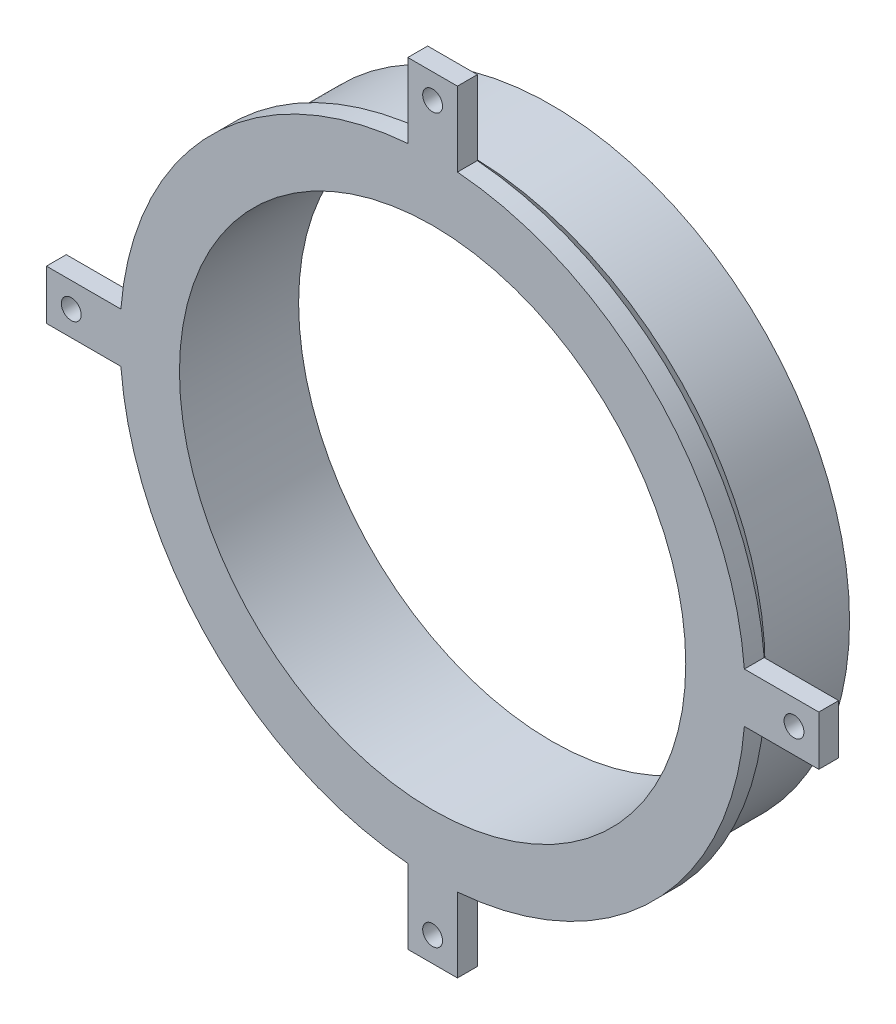
ISO-10303-21;
HEADER;
FILE_DESCRIPTION(('STEP AP214'),'2;1');
FILE_NAME('part.step','',(''),(''),'','','');
FILE_SCHEMA(('AUTOMOTIVE_DESIGN { 1 0 10303 214 1 1 1 1 }'));
ENDSEC;
DATA;
#1=APPLICATION_CONTEXT('core data for automotive mechanical design processes');
#2=APPLICATION_PROTOCOL_DEFINITION('international standard','automotive_design',2000,#1);
#3=PRODUCT_CONTEXT('',#1,'mechanical');
#4=PRODUCT('Part','Part','',(#3));
#5=PRODUCT_RELATED_PRODUCT_CATEGORY('part','',(#4));
#6=PRODUCT_DEFINITION_FORMATION('','',#4);
#7=PRODUCT_DEFINITION_CONTEXT('part definition',#1,'design');
#8=PRODUCT_DEFINITION('design','',#6,#7);
#9=PRODUCT_DEFINITION_SHAPE('','',#8);
#10=(LENGTH_UNIT() NAMED_UNIT(*) SI_UNIT(.MILLI.,.METRE.));
#11=(NAMED_UNIT(*) PLANE_ANGLE_UNIT() SI_UNIT($,.RADIAN.));
#12=(NAMED_UNIT(*) SI_UNIT($,.STERADIAN.) SOLID_ANGLE_UNIT());
#13=UNCERTAINTY_MEASURE_WITH_UNIT(LENGTH_MEASURE(1.E-05),#10,'distance_accuracy_value','');
#14=(GEOMETRIC_REPRESENTATION_CONTEXT(3) GLOBAL_UNCERTAINTY_ASSIGNED_CONTEXT((#13)) GLOBAL_UNIT_ASSIGNED_CONTEXT((#10,
#11,#12)) REPRESENTATION_CONTEXT('',''));
#15=CARTESIAN_POINT('',(0.,0.,0.));
#16=DIRECTION('',(0.,0.,1.));
#17=DIRECTION('',(1.,0.,0.));
#18=AXIS2_PLACEMENT_3D('',#15,#16,#17);
#19=CARTESIAN_POINT('',(0.,0.,0.));
#20=DIRECTION('',(0.,0.,1.));
#21=DIRECTION('',(1.,0.,0.));
#22=AXIS2_PLACEMENT_3D('',#19,#20,#21);
#23=PLANE('',#22);
#24=CARTESIAN_POINT('',(4.12044213492661E-12,-72.8012738724303,0.));
#25=DIRECTION('',(0.,0.,1.));
#26=DIRECTION('',(1.,0.,0.));
#27=AXIS2_PLACEMENT_3D('',#24,#25,#26);
#28=CIRCLE('',#27,2.00000000000443);
#29=CARTESIAN_POINT('',(2.00000000000855,-72.8012738724303,0.));
#30=VERTEX_POINT('',#29);
#31=EDGE_CURVE('E310',#30,#30,#28,.T.);
#32=ORIENTED_EDGE('',*,*,#31,.T.);
#33=EDGE_LOOP('',(#32));
#34=FACE_BOUND('',#33,.T.);
#35=DIRECTION('',(0.,-1.,0.));
#36=VECTOR('',#35,1.);
#37=CARTESIAN_POINT('',(-4.99999999999999,-77.8012738724305,0.));
#38=LINE('',#37,#36);
#39=CARTESIAN_POINT('',(-4.99999999999999,-62.8012738724304,0.));
#40=VERTEX_POINT('',#39);
#41=CARTESIAN_POINT('',(-4.99999999999999,-77.8012738724305,0.));
#42=VERTEX_POINT('',#41);
#43=EDGE_CURVE('E284',#40,#42,#38,.T.);
#44=ORIENTED_EDGE('',*,*,#43,.F.);
#45=CARTESIAN_POINT('',(0.,0.,0.));
#46=DIRECTION('',(0.,0.,1.));
#47=DIRECTION('',(1.,0.,0.));
#48=AXIS2_PLACEMENT_3D('',#45,#46,#47);
#49=CIRCLE('',#48,63.);
#50=CARTESIAN_POINT('',(5.00000000000008,-62.8012738724312,0.));
#51=VERTEX_POINT('',#50);
#52=EDGE_CURVE('E11',#40,#51,#49,.T.);
#53=ORIENTED_EDGE('',*,*,#52,.T.);
#54=DIRECTION('',(0.,1.,0.));
#55=VECTOR('',#54,1.);
#56=CARTESIAN_POINT('',(5.00000000000001,-77.8012738724305,0.));
#57=LINE('',#56,#55);
#58=CARTESIAN_POINT('',(5.00000000000001,-77.8012738724305,0.));
#59=VERTEX_POINT('',#58);
#60=EDGE_CURVE('E278',#59,#51,#57,.T.);
#61=ORIENTED_EDGE('',*,*,#60,.F.);
#62=DIRECTION('',(1.,0.,0.));
#63=VECTOR('',#62,1.);
#64=CARTESIAN_POINT('',(5.00000000000001,-77.8012738724305,0.));
#65=LINE('',#64,#63);
#66=EDGE_CURVE('E281',#42,#59,#65,.T.);
#67=ORIENTED_EDGE('',*,*,#66,.F.);
#68=EDGE_LOOP('',(#44,#53,#61,#67));
#69=FACE_BOUND('',#68,.T.);
#70=ADVANCED_FACE('F33',(#34,#69),#23,.F.);
#71=CARTESIAN_POINT('',(72.8012738724324,2.06022106746331E-12,0.));
#72=DIRECTION('',(0.,0.,1.));
#73=DIRECTION('',(1.,0.,0.));
#74=AXIS2_PLACEMENT_3D('',#71,#72,#73);
#75=CIRCLE('',#74,2.00000000000162);
#76=CARTESIAN_POINT('',(74.801273872434,2.06022106746331E-12,0.));
#77=VERTEX_POINT('',#76);
#78=EDGE_CURVE('E304',#77,#77,#75,.T.);
#79=ORIENTED_EDGE('',*,*,#78,.T.);
#80=EDGE_LOOP('',(#79));
#81=FACE_BOUND('',#80,.T.);
#82=DIRECTION('',(1.,0.,0.));
#83=VECTOR('',#82,1.);
#84=CARTESIAN_POINT('',(77.8012738724319,-5.00000000000012,0.));
#85=LINE('',#84,#83);
#86=CARTESIAN_POINT('',(62.8012738724319,-5.00000000000012,0.));
#87=VERTEX_POINT('',#86);
#88=CARTESIAN_POINT('',(77.8012738724319,-5.00000000000012,0.));
#89=VERTEX_POINT('',#88);
#90=EDGE_CURVE('E272',#87,#89,#85,.T.);
#91=ORIENTED_EDGE('',*,*,#90,.F.);
#92=CARTESIAN_POINT('',(0.,0.,0.));
#93=DIRECTION('',(0.,0.,1.));
#94=DIRECTION('',(1.,0.,0.));
#95=AXIS2_PLACEMENT_3D('',#92,#93,#94);
#96=CIRCLE('',#95,63.);
#97=CARTESIAN_POINT('',(62.8012738724311,4.99999999999982,0.));
#98=VERTEX_POINT('',#97);
#99=EDGE_CURVE('E42',#87,#98,#96,.T.);
#100=ORIENTED_EDGE('',*,*,#99,.T.);
#101=DIRECTION('',(-1.,0.,0.));
#102=VECTOR('',#101,1.);
#103=CARTESIAN_POINT('',(77.8012738724319,4.99999999999988,0.));
#104=LINE('',#103,#102);
#105=CARTESIAN_POINT('',(77.8012738724319,4.99999999999988,0.));
#106=VERTEX_POINT('',#105);
#107=EDGE_CURVE('E173',#106,#98,#104,.T.);
#108=ORIENTED_EDGE('',*,*,#107,.F.);
#109=DIRECTION('',(0.,1.,0.));
#110=VECTOR('',#109,1.);
#111=CARTESIAN_POINT('',(77.8012738724319,4.99999999999988,0.));
#112=LINE('',#111,#110);
#113=EDGE_CURVE('E269',#89,#106,#112,.T.);
#114=ORIENTED_EDGE('',*,*,#113,.F.);
#115=EDGE_LOOP('',(#91,#100,#108,#114));
#116=FACE_BOUND('',#115,.T.);
#117=ADVANCED_FACE('F358',(#81,#116),#23,.F.);
#118=CARTESIAN_POINT('',(0.,72.8012738724303,0.));
#119=DIRECTION('',(0.,0.,1.));
#120=DIRECTION('',(1.,0.,0.));
#121=AXIS2_PLACEMENT_3D('',#118,#119,#120);
#122=CIRCLE('',#121,2.);
#123=CARTESIAN_POINT('',(2.,72.8012738724303,0.));
#124=VERTEX_POINT('',#123);
#125=EDGE_CURVE('E266',#124,#124,#122,.T.);
#126=ORIENTED_EDGE('',*,*,#125,.T.);
#127=EDGE_LOOP('',(#126));
#128=FACE_BOUND('',#127,.T.);
#129=DIRECTION('',(0.,1.,0.));
#130=VECTOR('',#129,1.);
#131=CARTESIAN_POINT('',(5.,77.8012738724303,0.));
#132=LINE('',#131,#130);
#133=CARTESIAN_POINT('',(5.,62.8012738724303,0.));
#134=VERTEX_POINT('',#133);
#135=CARTESIAN_POINT('',(5.,77.8012738724303,0.));
#136=VERTEX_POINT('',#135);
#137=EDGE_CURVE('E154',#134,#136,#132,.T.);
#138=ORIENTED_EDGE('',*,*,#137,.F.);
#139=CARTESIAN_POINT('',(0.,0.,0.));
#140=DIRECTION('',(0.,0.,1.));
#141=DIRECTION('',(1.,0.,0.));
#142=AXIS2_PLACEMENT_3D('',#139,#140,#141);
#143=CIRCLE('',#142,63.);
#144=CARTESIAN_POINT('',(-5.,62.8012738724303,0.));
#145=VERTEX_POINT('',#144);
#146=EDGE_CURVE('E115',#134,#145,#143,.T.);
#147=ORIENTED_EDGE('',*,*,#146,.T.);
#148=DIRECTION('',(0.,-1.,0.));
#149=VECTOR('',#148,1.);
#150=CARTESIAN_POINT('',(-5.,77.8012738724303,0.));
#151=LINE('',#150,#149);
#152=CARTESIAN_POINT('',(-5.,77.8012738724303,0.));
#153=VERTEX_POINT('',#152);
#154=EDGE_CURVE('E223',#153,#145,#151,.T.);
#155=ORIENTED_EDGE('',*,*,#154,.F.);
#156=DIRECTION('',(-1.,0.,0.));
#157=VECTOR('',#156,1.);
#158=CARTESIAN_POINT('',(-5.,77.8012738724303,0.));
#159=LINE('',#158,#157);
#160=EDGE_CURVE('E164',#136,#153,#159,.T.);
#161=ORIENTED_EDGE('',*,*,#160,.F.);
#162=EDGE_LOOP('',(#138,#147,#155,#161));
#163=FACE_BOUND('',#162,.T.);
#164=ADVANCED_FACE('F163',(#128,#163),#23,.F.);
#165=CARTESIAN_POINT('',(0.,0.,0.));
#166=DIRECTION('',(0.,0.,-1.));
#167=DIRECTION('',(-1.,0.,0.));
#168=AXIS2_PLACEMENT_3D('',#165,#166,#167);
#169=CIRCLE('',#168,57.);
#170=CARTESIAN_POINT('',(-57.,0.,0.));
#171=VERTEX_POINT('',#170);
#172=EDGE_CURVE('E328',#171,#171,#169,.T.);
#173=ORIENTED_EDGE('',*,*,#172,.T.);
#174=EDGE_LOOP('',(#173));
#175=FACE_BOUND('',#174,.T.);
#176=CARTESIAN_POINT('',(0.,0.,0.));
#177=DIRECTION('',(0.,0.,1.));
#178=DIRECTION('',(1.,0.,0.));
#179=AXIS2_PLACEMENT_3D('',#176,#177,#178);
#180=CIRCLE('',#179,55.);
#181=CARTESIAN_POINT('',(55.,0.,0.));
#182=VERTEX_POINT('',#181);
#183=EDGE_CURVE('E187',#182,#182,#180,.F.);
#184=ORIENTED_EDGE('',*,*,#183,.F.);
#185=EDGE_LOOP('',(#184));
#186=FACE_BOUND('',#185,.T.);
#187=ADVANCED_FACE('F370',(#175,#186),#23,.F.);
#188=CARTESIAN_POINT('',(0.,0.,4.));
#189=DIRECTION('',(0.,0.,1.));
#190=DIRECTION('',(1.,0.,0.));
#191=AXIS2_PLACEMENT_3D('',#188,#189,#190);
#192=PLANE('',#191);
#193=CARTESIAN_POINT('',(0.,0.,4.));
#194=DIRECTION('',(0.,0.,1.));
#195=DIRECTION('',(1.,0.,0.));
#196=AXIS2_PLACEMENT_3D('',#193,#194,#195);
#197=CIRCLE('',#196,51.);
#198=CARTESIAN_POINT('',(51.,0.,4.));
#199=VERTEX_POINT('',#198);
#200=EDGE_CURVE('E190',#199,#199,#197,.T.);
#201=ORIENTED_EDGE('',*,*,#200,.F.);
#202=EDGE_LOOP('',(#201));
#203=FACE_BOUND('',#202,.T.);
#204=CARTESIAN_POINT('',(-72.8012738724283,-2.06913665216548E-12,4.));
#205=DIRECTION('',(0.,0.,1.));
#206=DIRECTION('',(1.,0.,0.));
#207=AXIS2_PLACEMENT_3D('',#204,#205,#206);
#208=CIRCLE('',#207,2.00000000000331);
#209=CARTESIAN_POINT('',(-70.801273872425,-2.06913665216548E-12,4.));
#210=VERTEX_POINT('',#209);
#211=EDGE_CURVE('E319',#210,#210,#208,.T.);
#212=ORIENTED_EDGE('',*,*,#211,.F.);
#213=EDGE_LOOP('',(#212));
#214=FACE_BOUND('',#213,.T.);
#215=CARTESIAN_POINT('',(4.12044213492661E-12,-72.8012738724303,4.));
#216=DIRECTION('',(0.,0.,1.));
#217=DIRECTION('',(1.,0.,0.));
#218=AXIS2_PLACEMENT_3D('',#215,#216,#217);
#219=CIRCLE('',#218,2.00000000000443);
#220=CARTESIAN_POINT('',(2.00000000000855,-72.8012738724303,4.));
#221=VERTEX_POINT('',#220);
#222=EDGE_CURVE('E313',#221,#221,#219,.T.);
#223=ORIENTED_EDGE('',*,*,#222,.F.);
#224=EDGE_LOOP('',(#223));
#225=FACE_BOUND('',#224,.T.);
#226=CARTESIAN_POINT('',(72.8012738724324,2.06022106746331E-12,4.));
#227=DIRECTION('',(0.,0.,1.));
#228=DIRECTION('',(1.,0.,0.));
#229=AXIS2_PLACEMENT_3D('',#226,#227,#228);
#230=CIRCLE('',#229,2.00000000000162);
#231=CARTESIAN_POINT('',(74.801273872434,2.06022106746331E-12,4.));
#232=VERTEX_POINT('',#231);
#233=EDGE_CURVE('E307',#232,#232,#230,.T.);
#234=ORIENTED_EDGE('',*,*,#233,.F.);
#235=EDGE_LOOP('',(#234));
#236=FACE_BOUND('',#235,.T.);
#237=CARTESIAN_POINT('',(0.,72.8012738724303,4.));
#238=DIRECTION('',(0.,0.,1.));
#239=DIRECTION('',(1.,0.,0.));
#240=AXIS2_PLACEMENT_3D('',#237,#238,#239);
#241=CIRCLE('',#240,2.);
#242=CARTESIAN_POINT('',(2.,72.8012738724303,4.));
#243=VERTEX_POINT('',#242);
#244=EDGE_CURVE('E301',#243,#243,#241,.T.);
#245=ORIENTED_EDGE('',*,*,#244,.F.);
#246=EDGE_LOOP('',(#245));
#247=FACE_BOUND('',#246,.T.);
#248=DIRECTION('',(0.,-1.,0.));
#249=VECTOR('',#248,1.);
#250=CARTESIAN_POINT('',(-5.,77.8012738724303,4.));
#251=LINE('',#250,#249);
#252=CARTESIAN_POINT('',(-5.,77.8012738724303,4.));
#253=VERTEX_POINT('',#252);
#254=CARTESIAN_POINT('',(-5.,62.8012738724303,4.));
#255=VERTEX_POINT('',#254);
#256=EDGE_CURVE('E263',#253,#255,#251,.T.);
#257=ORIENTED_EDGE('',*,*,#256,.T.);
#258=CARTESIAN_POINT('',(0.,0.,4.));
#259=DIRECTION('',(0.,0.,1.));
#260=DIRECTION('',(1.,0.,0.));
#261=AXIS2_PLACEMENT_3D('',#258,#259,#260);
#262=CIRCLE('',#261,63.);
#263=CARTESIAN_POINT('',(-62.8012738724304,4.99999999999844,4.));
#264=VERTEX_POINT('',#263);
#265=EDGE_CURVE('E260',#255,#264,#262,.T.);
#266=ORIENTED_EDGE('',*,*,#265,.T.);
#267=DIRECTION('',(-1.,0.,0.));
#268=VECTOR('',#267,1.);
#269=CARTESIAN_POINT('',(-77.8012738724305,4.99999999999842,4.));
#270=LINE('',#269,#268);
#271=CARTESIAN_POINT('',(-77.8012738724305,4.99999999999842,4.));
#272=VERTEX_POINT('',#271);
#273=EDGE_CURVE('E257',#264,#272,#270,.T.);
#274=ORIENTED_EDGE('',*,*,#273,.T.);
#275=DIRECTION('',(0.,-1.,0.));
#276=VECTOR('',#275,1.);
#277=CARTESIAN_POINT('',(-77.8012738724305,-5.00000000000158,4.));
#278=LINE('',#277,#276);
#279=CARTESIAN_POINT('',(-77.8012738724305,-5.00000000000158,4.));
#280=VERTEX_POINT('',#279);
#281=EDGE_CURVE('E254',#272,#280,#278,.T.);
#282=ORIENTED_EDGE('',*,*,#281,.T.);
#283=DIRECTION('',(1.,0.,0.));
#284=VECTOR('',#283,1.);
#285=CARTESIAN_POINT('',(-77.8012738724305,-5.00000000000158,4.));
#286=LINE('',#285,#284);
#287=CARTESIAN_POINT('',(-62.8012738724304,-5.00000000000156,4.));
#288=VERTEX_POINT('',#287);
#289=EDGE_CURVE('E251',#280,#288,#286,.T.);
#290=ORIENTED_EDGE('',*,*,#289,.T.);
#291=CARTESIAN_POINT('',(0.,0.,4.));
#292=DIRECTION('',(0.,0.,1.));
#293=DIRECTION('',(1.,0.,0.));
#294=AXIS2_PLACEMENT_3D('',#291,#292,#293);
#295=CIRCLE('',#294,63.0000000000002);
#296=CARTESIAN_POINT('',(-4.99999999999999,-62.8012738724304,4.));
#297=VERTEX_POINT('',#296);
#298=EDGE_CURVE('E248',#288,#297,#295,.T.);
#299=ORIENTED_EDGE('',*,*,#298,.T.);
#300=DIRECTION('',(0.,-1.,0.));
#301=VECTOR('',#300,1.);
#302=CARTESIAN_POINT('',(-4.99999999999999,-77.8012738724305,4.));
#303=LINE('',#302,#301);
#304=CARTESIAN_POINT('',(-4.99999999999999,-77.8012738724305,4.));
#305=VERTEX_POINT('',#304);
#306=EDGE_CURVE('E245',#297,#305,#303,.T.);
#307=ORIENTED_EDGE('',*,*,#306,.T.);
#308=DIRECTION('',(1.,0.,0.));
#309=VECTOR('',#308,1.);
#310=CARTESIAN_POINT('',(5.00000000000001,-77.8012738724305,4.));
#311=LINE('',#310,#309);
#312=CARTESIAN_POINT('',(5.00000000000001,-77.8012738724305,4.));
#313=VERTEX_POINT('',#312);
#314=EDGE_CURVE('E242',#305,#313,#311,.T.);
#315=ORIENTED_EDGE('',*,*,#314,.T.);
#316=DIRECTION('',(0.,1.,0.));
#317=VECTOR('',#316,1.);
#318=CARTESIAN_POINT('',(5.00000000000001,-77.8012738724305,4.));
#319=LINE('',#318,#317);
#320=CARTESIAN_POINT('',(5.00000000000008,-62.8012738724312,4.));
#321=VERTEX_POINT('',#320);
#322=EDGE_CURVE('E239',#313,#321,#319,.T.);
#323=ORIENTED_EDGE('',*,*,#322,.T.);
#324=CARTESIAN_POINT('',(0.,0.,4.));
#325=DIRECTION('',(0.,0.,1.));
#326=DIRECTION('',(1.,0.,0.));
#327=AXIS2_PLACEMENT_3D('',#324,#325,#326);
#328=CIRCLE('',#327,63.0000000000009);
#329=CARTESIAN_POINT('',(62.8012738724319,-5.00000000000012,4.));
#330=VERTEX_POINT('',#329);
#331=EDGE_CURVE('E236',#321,#330,#328,.T.);
#332=ORIENTED_EDGE('',*,*,#331,.T.);
#333=DIRECTION('',(1.,0.,0.));
#334=VECTOR('',#333,1.);
#335=CARTESIAN_POINT('',(77.8012738724319,-5.00000000000012,4.));
#336=LINE('',#335,#334);
#337=CARTESIAN_POINT('',(77.8012738724319,-5.00000000000012,4.));
#338=VERTEX_POINT('',#337);
#339=EDGE_CURVE('E233',#330,#338,#336,.T.);
#340=ORIENTED_EDGE('',*,*,#339,.T.);
#341=DIRECTION('',(0.,1.,0.));
#342=VECTOR('',#341,1.);
#343=CARTESIAN_POINT('',(77.8012738724319,4.99999999999988,4.));
#344=LINE('',#343,#342);
#345=CARTESIAN_POINT('',(77.8012738724319,4.99999999999988,4.));
#346=VERTEX_POINT('',#345);
#347=EDGE_CURVE('E230',#338,#346,#344,.T.);
#348=ORIENTED_EDGE('',*,*,#347,.T.);
#349=DIRECTION('',(-1.,0.,0.));
#350=VECTOR('',#349,1.);
#351=CARTESIAN_POINT('',(77.8012738724319,4.99999999999988,4.));
#352=LINE('',#351,#350);
#353=CARTESIAN_POINT('',(62.8012738724311,4.99999999999982,4.));
#354=VERTEX_POINT('',#353);
#355=EDGE_CURVE('E227',#346,#354,#352,.T.);
#356=ORIENTED_EDGE('',*,*,#355,.T.);
#357=CARTESIAN_POINT('',(0.,0.,4.));
#358=DIRECTION('',(0.,0.,1.));
#359=DIRECTION('',(1.,0.,0.));
#360=AXIS2_PLACEMENT_3D('',#357,#358,#359);
#361=CIRCLE('',#360,63.0000000000008);
#362=CARTESIAN_POINT('',(5.,62.8012738724303,4.));
#363=VERTEX_POINT('',#362);
#364=EDGE_CURVE('E225',#354,#363,#361,.T.);
#365=ORIENTED_EDGE('',*,*,#364,.T.);
#366=DIRECTION('',(0.,1.,0.));
#367=VECTOR('',#366,1.);
#368=CARTESIAN_POINT('',(5.,77.8012738724303,4.));
#369=LINE('',#368,#367);
#370=CARTESIAN_POINT('',(5.,77.8012738724303,4.));
#371=VERTEX_POINT('',#370);
#372=EDGE_CURVE('E156',#363,#371,#369,.T.);
#373=ORIENTED_EDGE('',*,*,#372,.T.);
#374=DIRECTION('',(-1.,0.,0.));
#375=VECTOR('',#374,1.);
#376=CARTESIAN_POINT('',(-5.,77.8012738724303,4.));
#377=LINE('',#376,#375);
#378=EDGE_CURVE('E220',#371,#253,#377,.T.);
#379=ORIENTED_EDGE('',*,*,#378,.T.);
#380=EDGE_LOOP('',(#257,#266,#274,#282,#290,#299,#307,#315,#323,#332,#340,#348,#356,#365,#373,#379));
#381=FACE_BOUND('',#380,.T.);
#382=ADVANCED_FACE('F368',(#203,#214,#225,#236,#247,#381),#192,.T.);
#383=CARTESIAN_POINT('',(-72.8012738724283,-2.06913665216548E-12,0.));
#384=DIRECTION('',(0.,0.,1.));
#385=DIRECTION('',(1.,0.,0.));
#386=AXIS2_PLACEMENT_3D('',#383,#384,#385);
#387=CIRCLE('',#386,2.00000000000331);
#388=CARTESIAN_POINT('',(-70.801273872425,-2.06913665216548E-12,0.));
#389=VERTEX_POINT('',#388);
#390=EDGE_CURVE('E316',#389,#389,#387,.T.);
#391=ORIENTED_EDGE('',*,*,#390,.T.);
#392=EDGE_LOOP('',(#391));
#393=FACE_BOUND('',#392,.T.);
#394=DIRECTION('',(-1.,0.,0.));
#395=VECTOR('',#394,1.);
#396=CARTESIAN_POINT('',(-77.8012738724305,4.99999999999842,0.));
#397=LINE('',#396,#395);
#398=CARTESIAN_POINT('',(-62.8012738724304,4.99999999999844,0.));
#399=VERTEX_POINT('',#398);
#400=CARTESIAN_POINT('',(-77.8012738724305,4.99999999999842,0.));
#401=VERTEX_POINT('',#400);
#402=EDGE_CURVE('E296',#399,#401,#397,.T.);
#403=ORIENTED_EDGE('',*,*,#402,.F.);
#404=CARTESIAN_POINT('',(0.,0.,0.));
#405=DIRECTION('',(0.,0.,1.));
#406=DIRECTION('',(1.,0.,0.));
#407=AXIS2_PLACEMENT_3D('',#404,#405,#406);
#408=CIRCLE('',#407,63.);
#409=CARTESIAN_POINT('',(-62.8012738724304,-5.00000000000156,0.));
#410=VERTEX_POINT('',#409);
#411=EDGE_CURVE('E180',#399,#410,#408,.T.);
#412=ORIENTED_EDGE('',*,*,#411,.T.);
#413=DIRECTION('',(1.,0.,0.));
#414=VECTOR('',#413,1.);
#415=CARTESIAN_POINT('',(-77.8012738724305,-5.00000000000158,0.));
#416=LINE('',#415,#414);
#417=CARTESIAN_POINT('',(-77.8012738724305,-5.00000000000158,0.));
#418=VERTEX_POINT('',#417);
#419=EDGE_CURVE('E290',#418,#410,#416,.T.);
#420=ORIENTED_EDGE('',*,*,#419,.F.);
#421=DIRECTION('',(0.,-1.,0.));
#422=VECTOR('',#421,1.);
#423=CARTESIAN_POINT('',(-77.8012738724305,-5.00000000000158,0.));
#424=LINE('',#423,#422);
#425=EDGE_CURVE('E293',#401,#418,#424,.T.);
#426=ORIENTED_EDGE('',*,*,#425,.F.);
#427=EDGE_LOOP('',(#403,#412,#420,#426));
#428=FACE_BOUND('',#427,.T.);
#429=ADVANCED_FACE('F360',(#393,#428),#23,.F.);
#430=CARTESIAN_POINT('',(0.,0.,4.));
#431=DIRECTION('',(0.,0.,-1.));
#432=DIRECTION('',(-1.,0.,0.));
#433=AXIS2_PLACEMENT_3D('',#430,#431,#432);
#434=CYLINDRICAL_SURFACE('',#433,51.);
#435=ORIENTED_EDGE('',*,*,#200,.T.);
#436=EDGE_LOOP('',(#435));
#437=FACE_BOUND('',#436,.T.);
#438=CARTESIAN_POINT('',(0.,0.,-20.));
#439=DIRECTION('',(0.,0.,-1.));
#440=DIRECTION('',(-1.,0.,0.));
#441=AXIS2_PLACEMENT_3D('',#438,#439,#440);
#442=CIRCLE('',#441,51.);
#443=CARTESIAN_POINT('',(-51.,0.,-20.));
#444=VERTEX_POINT('',#443);
#445=EDGE_CURVE('E336',#444,#444,#442,.T.);
#446=ORIENTED_EDGE('',*,*,#445,.T.);
#447=EDGE_LOOP('',(#446));
#448=FACE_BOUND('',#447,.T.);
#449=ADVANCED_FACE('F340',(#437,#448),#434,.F.);
#450=CARTESIAN_POINT('',(-5.,77.8012738724303,0.));
#451=DIRECTION('',(-1.,0.,0.));
#452=DIRECTION('',(0.,-1.,0.));
#453=AXIS2_PLACEMENT_3D('',#450,#451,#452);
#454=PLANE('',#453);
#455=ORIENTED_EDGE('',*,*,#256,.F.);
#456=DIRECTION('',(0.,0.,1.));
#457=VECTOR('',#456,1.);
#458=CARTESIAN_POINT('',(-5.,77.8012738724303,0.));
#459=LINE('',#458,#457);
#460=EDGE_CURVE('E50',#153,#253,#459,.T.);
#461=ORIENTED_EDGE('',*,*,#460,.F.);
#462=ORIENTED_EDGE('',*,*,#154,.T.);
#463=DIRECTION('',(0.,0.,1.));
#464=VECTOR('',#463,1.);
#465=CARTESIAN_POINT('',(-5.,62.8012738724303,0.));
#466=LINE('',#465,#464);
#467=EDGE_CURVE('E193',#145,#255,#466,.T.);
#468=ORIENTED_EDGE('',*,*,#467,.T.);
#469=EDGE_LOOP('',(#455,#461,#462,#468));
#470=FACE_BOUND('',#469,.T.);
#471=ADVANCED_FACE('F375',(#470),#454,.T.);
#472=CARTESIAN_POINT('',(-5.,77.8012738724303,0.));
#473=DIRECTION('',(0.,1.,0.));
#474=DIRECTION('',(0.,0.,1.));
#475=AXIS2_PLACEMENT_3D('',#472,#473,#474);
#476=PLANE('',#475);
#477=ORIENTED_EDGE('',*,*,#378,.F.);
#478=DIRECTION('',(0.,0.,1.));
#479=VECTOR('',#478,1.);
#480=CARTESIAN_POINT('',(5.,77.8012738724303,0.));
#481=LINE('',#480,#479);
#482=EDGE_CURVE('E103',#136,#371,#481,.T.);
#483=ORIENTED_EDGE('',*,*,#482,.F.);
#484=ORIENTED_EDGE('',*,*,#160,.T.);
#485=ORIENTED_EDGE('',*,*,#460,.T.);
#486=EDGE_LOOP('',(#477,#483,#484,#485));
#487=FACE_BOUND('',#486,.T.);
#488=ADVANCED_FACE('F485',(#487),#476,.T.);
#489=CARTESIAN_POINT('',(5.,77.8012738724303,0.));
#490=DIRECTION('',(1.,0.,0.));
#491=DIRECTION('',(0.,1.,0.));
#492=AXIS2_PLACEMENT_3D('',#489,#490,#491);
#493=PLANE('',#492);
#494=ORIENTED_EDGE('',*,*,#372,.F.);
#495=DIRECTION('',(0.,0.,1.));
#496=VECTOR('',#495,1.);
#497=CARTESIAN_POINT('',(5.,62.8012738724303,0.));
#498=LINE('',#497,#496);
#499=EDGE_CURVE('E152',#134,#363,#498,.T.);
#500=ORIENTED_EDGE('',*,*,#499,.F.);
#501=ORIENTED_EDGE('',*,*,#137,.T.);
#502=ORIENTED_EDGE('',*,*,#482,.T.);
#503=EDGE_LOOP('',(#494,#500,#501,#502));
#504=FACE_BOUND('',#503,.T.);
#505=ADVANCED_FACE('F153',(#504),#493,.T.);
#506=CARTESIAN_POINT('',(0.,0.,0.));
#507=DIRECTION('',(0.,0.,1.));
#508=DIRECTION('',(1.,0.,0.));
#509=AXIS2_PLACEMENT_3D('',#506,#507,#508);
#510=CYLINDRICAL_SURFACE('',#509,63.0000000000008);
#511=ORIENTED_EDGE('',*,*,#364,.F.);
#512=DIRECTION('',(0.,0.,1.));
#513=VECTOR('',#512,1.);
#514=CARTESIAN_POINT('',(62.8012738724311,4.99999999999982,0.));
#515=LINE('',#514,#513);
#516=EDGE_CURVE('E161',#98,#354,#515,.T.);
#517=ORIENTED_EDGE('',*,*,#516,.F.);
#518=CARTESIAN_POINT('',(0.,0.,0.));
#519=DIRECTION('',(0.,0.,1.));
#520=DIRECTION('',(1.,0.,0.));
#521=AXIS2_PLACEMENT_3D('',#518,#519,#520);
#522=CIRCLE('',#521,63.0000000000008);
#523=EDGE_CURVE('E165',#98,#134,#522,.T.);
#524=ORIENTED_EDGE('',*,*,#523,.T.);
#525=ORIENTED_EDGE('',*,*,#499,.T.);
#526=EDGE_LOOP('',(#511,#517,#524,#525));
#527=FACE_BOUND('',#526,.T.);
#528=ADVANCED_FACE('F169',(#527),#510,.T.);
#529=CARTESIAN_POINT('',(77.8012738724319,4.99999999999988,0.));
#530=DIRECTION('',(0.,1.,0.));
#531=DIRECTION('',(-1.,0.,0.));
#532=AXIS2_PLACEMENT_3D('',#529,#530,#531);
#533=PLANE('',#532);
#534=ORIENTED_EDGE('',*,*,#355,.F.);
#535=DIRECTION('',(0.,0.,1.));
#536=VECTOR('',#535,1.);
#537=CARTESIAN_POINT('',(77.8012738724319,4.99999999999988,0.));
#538=LINE('',#537,#536);
#539=EDGE_CURVE('E215',#106,#346,#538,.T.);
#540=ORIENTED_EDGE('',*,*,#539,.F.);
#541=ORIENTED_EDGE('',*,*,#107,.T.);
#542=ORIENTED_EDGE('',*,*,#516,.T.);
#543=EDGE_LOOP('',(#534,#540,#541,#542));
#544=FACE_BOUND('',#543,.T.);
#545=ADVANCED_FACE('F451',(#544),#533,.T.);
#546=CARTESIAN_POINT('',(77.8012738724319,4.99999999999988,0.));
#547=DIRECTION('',(1.,0.,0.));
#548=DIRECTION('',(0.,0.,-1.));
#549=AXIS2_PLACEMENT_3D('',#546,#547,#548);
#550=PLANE('',#549);
#551=ORIENTED_EDGE('',*,*,#347,.F.);
#552=DIRECTION('',(0.,0.,1.));
#553=VECTOR('',#552,1.);
#554=CARTESIAN_POINT('',(77.8012738724319,-5.00000000000012,0.));
#555=LINE('',#554,#553);
#556=EDGE_CURVE('E213',#89,#338,#555,.T.);
#557=ORIENTED_EDGE('',*,*,#556,.F.);
#558=ORIENTED_EDGE('',*,*,#113,.T.);
#559=ORIENTED_EDGE('',*,*,#539,.T.);
#560=EDGE_LOOP('',(#551,#557,#558,#559));
#561=FACE_BOUND('',#560,.T.);
#562=ADVANCED_FACE('F448',(#561),#550,.T.);
#563=CARTESIAN_POINT('',(77.8012738724319,-5.00000000000012,0.));
#564=DIRECTION('',(0.,-1.,0.));
#565=DIRECTION('',(1.,0.,0.));
#566=AXIS2_PLACEMENT_3D('',#563,#564,#565);
#567=PLANE('',#566);
#568=ORIENTED_EDGE('',*,*,#339,.F.);
#569=DIRECTION('',(0.,0.,1.));
#570=VECTOR('',#569,1.);
#571=CARTESIAN_POINT('',(62.8012738724319,-5.00000000000012,0.));
#572=LINE('',#571,#570);
#573=EDGE_CURVE('E211',#87,#330,#572,.T.);
#574=ORIENTED_EDGE('',*,*,#573,.F.);
#575=ORIENTED_EDGE('',*,*,#90,.T.);
#576=ORIENTED_EDGE('',*,*,#556,.T.);
#577=EDGE_LOOP('',(#568,#574,#575,#576));
#578=FACE_BOUND('',#577,.T.);
#579=ADVANCED_FACE('F444',(#578),#567,.T.);
#580=CARTESIAN_POINT('',(0.,0.,0.));
#581=DIRECTION('',(0.,0.,1.));
#582=DIRECTION('',(1.,0.,0.));
#583=AXIS2_PLACEMENT_3D('',#580,#581,#582);
#584=CYLINDRICAL_SURFACE('',#583,63.0000000000009);
#585=ORIENTED_EDGE('',*,*,#331,.F.);
#586=DIRECTION('',(0.,0.,1.));
#587=VECTOR('',#586,1.);
#588=CARTESIAN_POINT('',(5.00000000000008,-62.8012738724312,0.));
#589=LINE('',#588,#587);
#590=EDGE_CURVE('E209',#51,#321,#589,.T.);
#591=ORIENTED_EDGE('',*,*,#590,.F.);
#592=CARTESIAN_POINT('',(0.,0.,0.));
#593=DIRECTION('',(0.,0.,1.));
#594=DIRECTION('',(1.,0.,0.));
#595=AXIS2_PLACEMENT_3D('',#592,#593,#594);
#596=CIRCLE('',#595,63.0000000000009);
#597=EDGE_CURVE('E275',#51,#87,#596,.T.);
#598=ORIENTED_EDGE('',*,*,#597,.T.);
#599=ORIENTED_EDGE('',*,*,#573,.T.);
#600=EDGE_LOOP('',(#585,#591,#598,#599));
#601=FACE_BOUND('',#600,.T.);
#602=ADVANCED_FACE('F440',(#601),#584,.T.);
#603=CARTESIAN_POINT('',(5.00000000000001,-77.8012738724305,0.));
#604=DIRECTION('',(1.,0.,0.));
#605=DIRECTION('',(0.,0.,-1.));
#606=AXIS2_PLACEMENT_3D('',#603,#604,#605);
#607=PLANE('',#606);
#608=ORIENTED_EDGE('',*,*,#322,.F.);
#609=DIRECTION('',(0.,0.,1.));
#610=VECTOR('',#609,1.);
#611=CARTESIAN_POINT('',(5.00000000000001,-77.8012738724305,0.));
#612=LINE('',#611,#610);
#613=EDGE_CURVE('E207',#59,#313,#612,.T.);
#614=ORIENTED_EDGE('',*,*,#613,.F.);
#615=ORIENTED_EDGE('',*,*,#60,.T.);
#616=ORIENTED_EDGE('',*,*,#590,.T.);
#617=EDGE_LOOP('',(#608,#614,#615,#616));
#618=FACE_BOUND('',#617,.T.);
#619=ADVANCED_FACE('F435',(#618),#607,.T.);
#620=CARTESIAN_POINT('',(5.00000000000001,-77.8012738724305,0.));
#621=DIRECTION('',(0.,-1.,0.));
#622=DIRECTION('',(0.,0.,-1.));
#623=AXIS2_PLACEMENT_3D('',#620,#621,#622);
#624=PLANE('',#623);
#625=ORIENTED_EDGE('',*,*,#314,.F.);
#626=DIRECTION('',(0.,0.,1.));
#627=VECTOR('',#626,1.);
#628=CARTESIAN_POINT('',(-4.99999999999999,-77.8012738724305,0.));
#629=LINE('',#628,#627);
#630=EDGE_CURVE('E205',#42,#305,#629,.T.);
#631=ORIENTED_EDGE('',*,*,#630,.F.);
#632=ORIENTED_EDGE('',*,*,#66,.T.);
#633=ORIENTED_EDGE('',*,*,#613,.T.);
#634=EDGE_LOOP('',(#625,#631,#632,#633));
#635=FACE_BOUND('',#634,.T.);
#636=ADVANCED_FACE('F431',(#635),#624,.T.);
#637=CARTESIAN_POINT('',(-4.99999999999999,-77.8012738724305,0.));
#638=DIRECTION('',(-1.,0.,0.));
#639=DIRECTION('',(0.,-1.,0.));
#640=AXIS2_PLACEMENT_3D('',#637,#638,#639);
#641=PLANE('',#640);
#642=ORIENTED_EDGE('',*,*,#306,.F.);
#643=DIRECTION('',(0.,0.,1.));
#644=VECTOR('',#643,1.);
#645=CARTESIAN_POINT('',(-4.99999999999999,-62.8012738724304,0.));
#646=LINE('',#645,#644);
#647=EDGE_CURVE('E203',#40,#297,#646,.T.);
#648=ORIENTED_EDGE('',*,*,#647,.F.);
#649=ORIENTED_EDGE('',*,*,#43,.T.);
#650=ORIENTED_EDGE('',*,*,#630,.T.);
#651=EDGE_LOOP('',(#642,#648,#649,#650));
#652=FACE_BOUND('',#651,.T.);
#653=ADVANCED_FACE('F427',(#652),#641,.T.);
#654=CARTESIAN_POINT('',(0.,0.,0.));
#655=DIRECTION('',(0.,0.,1.));
#656=DIRECTION('',(1.,0.,0.));
#657=AXIS2_PLACEMENT_3D('',#654,#655,#656);
#658=CYLINDRICAL_SURFACE('',#657,63.0000000000002);
#659=ORIENTED_EDGE('',*,*,#298,.F.);
#660=DIRECTION('',(0.,0.,1.));
#661=VECTOR('',#660,1.);
#662=CARTESIAN_POINT('',(-62.8012738724304,-5.00000000000156,0.));
#663=LINE('',#662,#661);
#664=EDGE_CURVE('E201',#410,#288,#663,.T.);
#665=ORIENTED_EDGE('',*,*,#664,.F.);
#666=CARTESIAN_POINT('',(0.,0.,0.));
#667=DIRECTION('',(0.,0.,1.));
#668=DIRECTION('',(1.,0.,0.));
#669=AXIS2_PLACEMENT_3D('',#666,#667,#668);
#670=CIRCLE('',#669,63.0000000000002);
#671=EDGE_CURVE('E287',#410,#40,#670,.T.);
#672=ORIENTED_EDGE('',*,*,#671,.T.);
#673=ORIENTED_EDGE('',*,*,#647,.T.);
#674=EDGE_LOOP('',(#659,#665,#672,#673));
#675=FACE_BOUND('',#674,.T.);
#676=ADVANCED_FACE('F422',(#675),#658,.T.);
#677=CARTESIAN_POINT('',(-77.8012738724305,-5.00000000000158,0.));
#678=DIRECTION('',(0.,-1.,0.));
#679=DIRECTION('',(1.,0.,0.));
#680=AXIS2_PLACEMENT_3D('',#677,#678,#679);
#681=PLANE('',#680);
#682=ORIENTED_EDGE('',*,*,#289,.F.);
#683=DIRECTION('',(0.,0.,1.));
#684=VECTOR('',#683,1.);
#685=CARTESIAN_POINT('',(-77.8012738724305,-5.00000000000158,0.));
#686=LINE('',#685,#684);
#687=EDGE_CURVE('E199',#418,#280,#686,.T.);
#688=ORIENTED_EDGE('',*,*,#687,.F.);
#689=ORIENTED_EDGE('',*,*,#419,.T.);
#690=ORIENTED_EDGE('',*,*,#664,.T.);
#691=EDGE_LOOP('',(#682,#688,#689,#690));
#692=FACE_BOUND('',#691,.T.);
#693=ADVANCED_FACE('F417',(#692),#681,.T.);
#694=CARTESIAN_POINT('',(-77.8012738724305,-5.00000000000158,0.));
#695=DIRECTION('',(-1.,0.,0.));
#696=DIRECTION('',(0.,0.,1.));
#697=AXIS2_PLACEMENT_3D('',#694,#695,#696);
#698=PLANE('',#697);
#699=ORIENTED_EDGE('',*,*,#281,.F.);
#700=DIRECTION('',(0.,0.,1.));
#701=VECTOR('',#700,1.);
#702=CARTESIAN_POINT('',(-77.8012738724305,4.99999999999842,0.));
#703=LINE('',#702,#701);
#704=EDGE_CURVE('E197',#401,#272,#703,.T.);
#705=ORIENTED_EDGE('',*,*,#704,.F.);
#706=ORIENTED_EDGE('',*,*,#425,.T.);
#707=ORIENTED_EDGE('',*,*,#687,.T.);
#708=EDGE_LOOP('',(#699,#705,#706,#707));
#709=FACE_BOUND('',#708,.T.);
#710=ADVANCED_FACE('F413',(#709),#698,.T.);
#711=CARTESIAN_POINT('',(-77.8012738724305,4.99999999999842,0.));
#712=DIRECTION('',(0.,1.,0.));
#713=DIRECTION('',(-1.,0.,0.));
#714=AXIS2_PLACEMENT_3D('',#711,#712,#713);
#715=PLANE('',#714);
#716=ORIENTED_EDGE('',*,*,#273,.F.);
#717=DIRECTION('',(0.,0.,1.));
#718=VECTOR('',#717,1.);
#719=CARTESIAN_POINT('',(-62.8012738724304,4.99999999999844,0.));
#720=LINE('',#719,#718);
#721=EDGE_CURVE('E195',#399,#264,#720,.T.);
#722=ORIENTED_EDGE('',*,*,#721,.F.);
#723=ORIENTED_EDGE('',*,*,#402,.T.);
#724=ORIENTED_EDGE('',*,*,#704,.T.);
#725=EDGE_LOOP('',(#716,#722,#723,#724));
#726=FACE_BOUND('',#725,.T.);
#727=ADVANCED_FACE('F409',(#726),#715,.T.);
#728=CARTESIAN_POINT('',(0.,0.,0.));
#729=DIRECTION('',(0.,0.,1.));
#730=DIRECTION('',(1.,0.,0.));
#731=AXIS2_PLACEMENT_3D('',#728,#729,#730);
#732=CYLINDRICAL_SURFACE('',#731,63.);
#733=ORIENTED_EDGE('',*,*,#265,.F.);
#734=ORIENTED_EDGE('',*,*,#467,.F.);
#735=CARTESIAN_POINT('',(0.,0.,0.));
#736=DIRECTION('',(0.,0.,1.));
#737=DIRECTION('',(1.,0.,0.));
#738=AXIS2_PLACEMENT_3D('',#735,#736,#737);
#739=CIRCLE('',#738,63.);
#740=EDGE_CURVE('E179',#145,#399,#739,.T.);
#741=ORIENTED_EDGE('',*,*,#740,.T.);
#742=ORIENTED_EDGE('',*,*,#721,.T.);
#743=EDGE_LOOP('',(#733,#734,#741,#742));
#744=FACE_BOUND('',#743,.T.);
#745=ADVANCED_FACE('F399',(#744),#732,.T.);
#746=CARTESIAN_POINT('',(0.,72.8012738724303,0.));
#747=DIRECTION('',(0.,0.,1.));
#748=DIRECTION('',(1.,0.,0.));
#749=AXIS2_PLACEMENT_3D('',#746,#747,#748);
#750=CYLINDRICAL_SURFACE('',#749,2.);
#751=ORIENTED_EDGE('',*,*,#125,.F.);
#752=EDGE_LOOP('',(#751));
#753=FACE_BOUND('',#752,.T.);
#754=ORIENTED_EDGE('',*,*,#244,.T.);
#755=EDGE_LOOP('',(#754));
#756=FACE_BOUND('',#755,.T.);
#757=ADVANCED_FACE('F395',(#753,#756),#750,.F.);
#758=CARTESIAN_POINT('',(72.8012738724324,2.06022106746331E-12,0.));
#759=DIRECTION('',(0.,0.,1.));
#760=DIRECTION('',(1.,0.,0.));
#761=AXIS2_PLACEMENT_3D('',#758,#759,#760);
#762=CYLINDRICAL_SURFACE('',#761,2.00000000000162);
#763=ORIENTED_EDGE('',*,*,#78,.F.);
#764=EDGE_LOOP('',(#763));
#765=FACE_BOUND('',#764,.T.);
#766=ORIENTED_EDGE('',*,*,#233,.T.);
#767=EDGE_LOOP('',(#766));
#768=FACE_BOUND('',#767,.T.);
#769=ADVANCED_FACE('F398',(#765,#768),#762,.F.);
#770=CARTESIAN_POINT('',(4.12044213492661E-12,-72.8012738724303,0.));
#771=DIRECTION('',(0.,0.,1.));
#772=DIRECTION('',(1.,0.,0.));
#773=AXIS2_PLACEMENT_3D('',#770,#771,#772);
#774=CYLINDRICAL_SURFACE('',#773,2.00000000000443);
#775=ORIENTED_EDGE('',*,*,#31,.F.);
#776=EDGE_LOOP('',(#775));
#777=FACE_BOUND('',#776,.T.);
#778=ORIENTED_EDGE('',*,*,#222,.T.);
#779=EDGE_LOOP('',(#778));
#780=FACE_BOUND('',#779,.T.);
#781=ADVANCED_FACE('F496',(#777,#780),#774,.F.);
#782=CARTESIAN_POINT('',(-72.8012738724283,-2.06913665216548E-12,0.));
#783=DIRECTION('',(0.,0.,1.));
#784=DIRECTION('',(1.,0.,0.));
#785=AXIS2_PLACEMENT_3D('',#782,#783,#784);
#786=CYLINDRICAL_SURFACE('',#785,2.00000000000331);
#787=ORIENTED_EDGE('',*,*,#390,.F.);
#788=EDGE_LOOP('',(#787));
#789=FACE_BOUND('',#788,.T.);
#790=ORIENTED_EDGE('',*,*,#211,.T.);
#791=EDGE_LOOP('',(#790));
#792=FACE_BOUND('',#791,.T.);
#793=ADVANCED_FACE('F500',(#789,#792),#786,.F.);
#794=CARTESIAN_POINT('',(0.,0.,-20.));
#795=DIRECTION('',(0.,0.,-1.));
#796=DIRECTION('',(-1.,0.,0.));
#797=AXIS2_PLACEMENT_3D('',#794,#795,#796);
#798=PLANE('',#797);
#799=CARTESIAN_POINT('',(0.,0.,-20.));
#800=DIRECTION('',(0.,0.,-1.));
#801=DIRECTION('',(-1.,0.,0.));
#802=AXIS2_PLACEMENT_3D('',#799,#800,#801);
#803=CIRCLE('',#802,60.);
#804=CARTESIAN_POINT('',(-60.,0.,-20.));
#805=VERTEX_POINT('',#804);
#806=EDGE_CURVE('E322',#805,#805,#803,.T.);
#807=ORIENTED_EDGE('',*,*,#806,.T.);
#808=EDGE_LOOP('',(#807));
#809=FACE_BOUND('',#808,.T.);
#810=CARTESIAN_POINT('',(0.,0.,-20.));
#811=DIRECTION('',(0.,0.,-1.));
#812=DIRECTION('',(-1.,0.,0.));
#813=AXIS2_PLACEMENT_3D('',#810,#811,#812);
#814=CIRCLE('',#813,57.);
#815=CARTESIAN_POINT('',(-57.,0.,-20.));
#816=VERTEX_POINT('',#815);
#817=EDGE_CURVE('E327',#816,#816,#814,.T.);
#818=ORIENTED_EDGE('',*,*,#817,.F.);
#819=EDGE_LOOP('',(#818));
#820=FACE_BOUND('',#819,.T.);
#821=ADVANCED_FACE('F504',(#809,#820),#798,.T.);
#822=CARTESIAN_POINT('',(0.,0.,-20.));
#823=DIRECTION('',(0.,0.,1.));
#824=DIRECTION('',(1.,0.,0.));
#825=AXIS2_PLACEMENT_3D('',#822,#823,#824);
#826=CYLINDRICAL_SURFACE('',#825,60.);
#827=CARTESIAN_POINT('',(0.,0.,-3.));
#828=DIRECTION('',(0.,0.,1.));
#829=DIRECTION('',(1.,0.,0.));
#830=AXIS2_PLACEMENT_3D('',#827,#828,#829);
#831=CIRCLE('',#830,60.);
#832=CARTESIAN_POINT('',(60.,0.,-3.));
#833=VERTEX_POINT('',#832);
#834=EDGE_CURVE('E182',#833,#833,#831,.F.);
#835=ORIENTED_EDGE('',*,*,#834,.T.);
#836=EDGE_LOOP('',(#835));
#837=FACE_BOUND('',#836,.T.);
#838=ORIENTED_EDGE('',*,*,#806,.F.);
#839=EDGE_LOOP('',(#838));
#840=FACE_BOUND('',#839,.T.);
#841=ADVANCED_FACE('F354',(#837,#840),#826,.T.);
#842=CARTESIAN_POINT('',(0.,0.,-20.));
#843=DIRECTION('',(0.,0.,1.));
#844=DIRECTION('',(1.,0.,0.));
#845=AXIS2_PLACEMENT_3D('',#842,#843,#844);
#846=CYLINDRICAL_SURFACE('',#845,57.);
#847=ORIENTED_EDGE('',*,*,#817,.T.);
#848=EDGE_LOOP('',(#847));
#849=FACE_BOUND('',#848,.T.);
#850=ORIENTED_EDGE('',*,*,#172,.F.);
#851=EDGE_LOOP('',(#850));
#852=FACE_BOUND('',#851,.T.);
#853=ADVANCED_FACE('F345',(#849,#852),#846,.F.);
#854=CARTESIAN_POINT('',(0.,0.,-20.));
#855=DIRECTION('',(0.,0.,-1.));
#856=DIRECTION('',(-1.,0.,0.));
#857=AXIS2_PLACEMENT_3D('',#854,#855,#856);
#858=PLANE('',#857);
#859=CARTESIAN_POINT('',(0.,0.,-20.));
#860=DIRECTION('',(0.,0.,-1.));
#861=DIRECTION('',(-1.,0.,0.));
#862=AXIS2_PLACEMENT_3D('',#859,#860,#861);
#863=CIRCLE('',#862,55.);
#864=CARTESIAN_POINT('',(-55.,0.,-20.));
#865=VERTEX_POINT('',#864);
#866=EDGE_CURVE('E331',#865,#865,#863,.T.);
#867=ORIENTED_EDGE('',*,*,#866,.T.);
#868=EDGE_LOOP('',(#867));
#869=FACE_BOUND('',#868,.T.);
#870=ORIENTED_EDGE('',*,*,#445,.F.);
#871=EDGE_LOOP('',(#870));
#872=FACE_BOUND('',#871,.T.);
#873=ADVANCED_FACE('F342',(#869,#872),#858,.T.);
#874=CARTESIAN_POINT('',(0.,0.,-20.));
#875=DIRECTION('',(0.,0.,1.));
#876=DIRECTION('',(1.,0.,0.));
#877=AXIS2_PLACEMENT_3D('',#874,#875,#876);
#878=CYLINDRICAL_SURFACE('',#877,55.);
#879=ORIENTED_EDGE('',*,*,#866,.F.);
#880=EDGE_LOOP('',(#879));
#881=FACE_BOUND('',#880,.T.);
#882=ORIENTED_EDGE('',*,*,#183,.T.);
#883=EDGE_LOOP('',(#882));
#884=FACE_BOUND('',#883,.T.);
#885=ADVANCED_FACE('F344',(#881,#884),#878,.T.);
#886=CARTESIAN_POINT('',(0.,0.,-3.));
#887=DIRECTION('',(0.,0.,1.));
#888=DIRECTION('',(1.,0.,0.));
#889=AXIS2_PLACEMENT_3D('',#886,#887,#888);
#890=CONICAL_SURFACE('',#889,60.,0.785398163397444);
#891=ORIENTED_EDGE('',*,*,#52,.F.);
#892=ORIENTED_EDGE('',*,*,#671,.F.);
#893=ORIENTED_EDGE('',*,*,#411,.F.);
#894=ORIENTED_EDGE('',*,*,#740,.F.);
#895=ORIENTED_EDGE('',*,*,#146,.F.);
#896=ORIENTED_EDGE('',*,*,#523,.F.);
#897=ORIENTED_EDGE('',*,*,#99,.F.);
#898=ORIENTED_EDGE('',*,*,#597,.F.);
#899=EDGE_LOOP('',(#891,#892,#893,#894,#895,#896,#897,#898));
#900=FACE_BOUND('',#899,.T.);
#901=ORIENTED_EDGE('',*,*,#834,.F.);
#902=EDGE_LOOP('',(#901));
#903=FACE_BOUND('',#902,.T.);
#904=ADVANCED_FACE('F35',(#900,#903),#890,.T.);
#905=CLOSED_SHELL('',(#70,#117,#164,#187,#382,#429,#449,#471,#488,#505,#528,#545,#562,#579,#602,
#619,#636,#653,#676,#693,#710,#727,#745,#757,#769,#781,#793,#821,#841,#853,#873,#885,#904));
#906=MANIFOLD_SOLID_BREP('B2',#905);
#907=ADVANCED_BREP_SHAPE_REPRESENTATION('',(#18,#906),#14);
#908=SHAPE_DEFINITION_REPRESENTATION(#9,#907);
ENDSEC;
END-ISO-10303-21;
